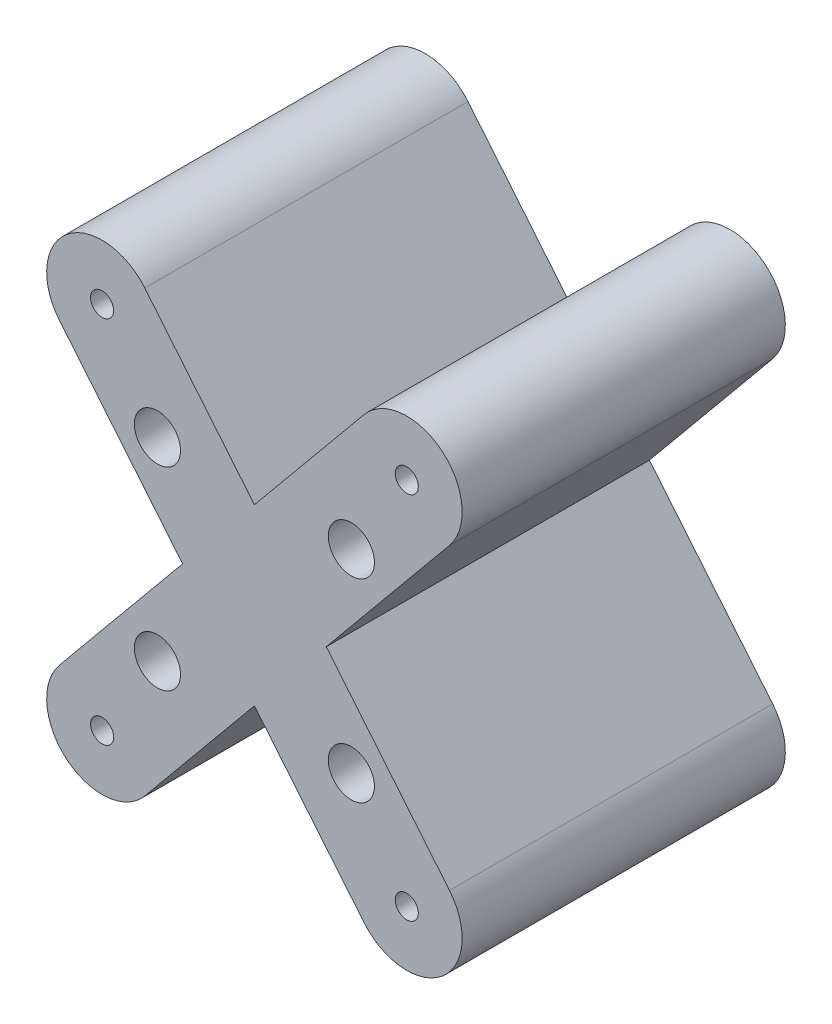
ISO-10303-21;
HEADER;
FILE_DESCRIPTION(('STEP AP214'),'2;1');
FILE_NAME('part.step','',(''),(''),'','','');
FILE_SCHEMA(('AUTOMOTIVE_DESIGN { 1 0 10303 214 1 1 1 1 }'));
ENDSEC;
DATA;
#1=APPLICATION_CONTEXT('core data for automotive mechanical design processes');
#2=APPLICATION_PROTOCOL_DEFINITION('international standard','automotive_design',2000,#1);
#3=PRODUCT_CONTEXT('',#1,'mechanical');
#4=PRODUCT('Part','Part','',(#3));
#5=PRODUCT_RELATED_PRODUCT_CATEGORY('part','',(#4));
#6=PRODUCT_DEFINITION_FORMATION('','',#4);
#7=PRODUCT_DEFINITION_CONTEXT('part definition',#1,'design');
#8=PRODUCT_DEFINITION('design','',#6,#7);
#9=PRODUCT_DEFINITION_SHAPE('','',#8);
#10=(LENGTH_UNIT() NAMED_UNIT(*) SI_UNIT(.MILLI.,.METRE.));
#11=(NAMED_UNIT(*) PLANE_ANGLE_UNIT() SI_UNIT($,.RADIAN.));
#12=(NAMED_UNIT(*) SI_UNIT($,.STERADIAN.) SOLID_ANGLE_UNIT());
#13=UNCERTAINTY_MEASURE_WITH_UNIT(LENGTH_MEASURE(1.E-05),#10,'distance_accuracy_value','');
#14=(GEOMETRIC_REPRESENTATION_CONTEXT(3) GLOBAL_UNCERTAINTY_ASSIGNED_CONTEXT((#13)) GLOBAL_UNIT_ASSIGNED_CONTEXT((#10,
#11,#12)) REPRESENTATION_CONTEXT('',''));
#15=CARTESIAN_POINT('',(0.,0.,0.));
#16=DIRECTION('',(0.,0.,1.));
#17=DIRECTION('',(1.,0.,0.));
#18=AXIS2_PLACEMENT_3D('',#15,#16,#17);
#19=CARTESIAN_POINT('',(33.,40.,70.));
#20=DIRECTION('',(0.,0.,-1.));
#21=DIRECTION('',(-1.,0.,0.));
#22=AXIS2_PLACEMENT_3D('',#19,#20,#21);
#23=CYLINDRICAL_SURFACE('',#22,2.5);
#24=CARTESIAN_POINT('',(33.,40.,70.));
#25=DIRECTION('',(0.,0.,1.));
#26=DIRECTION('',(1.,0.,0.));
#27=AXIS2_PLACEMENT_3D('',#24,#25,#26);
#28=CIRCLE('',#27,2.5);
#29=CARTESIAN_POINT('',(35.5,40.,70.));
#30=VERTEX_POINT('',#29);
#31=EDGE_CURVE('E281',#30,#30,#28,.T.);
#32=ORIENTED_EDGE('',*,*,#31,.T.);
#33=EDGE_LOOP('',(#32));
#34=FACE_BOUND('',#33,.T.);
#35=CARTESIAN_POINT('',(33.,40.,65.));
#36=DIRECTION('',(0.,0.,-1.));
#37=DIRECTION('',(-1.,0.,0.));
#38=AXIS2_PLACEMENT_3D('',#35,#36,#37);
#39=CIRCLE('',#38,2.5);
#40=CARTESIAN_POINT('',(30.5,40.,65.));
#41=VERTEX_POINT('',#40);
#42=EDGE_CURVE('E37',#41,#41,#39,.T.);
#43=ORIENTED_EDGE('',*,*,#42,.T.);
#44=EDGE_LOOP('',(#43));
#45=FACE_BOUND('',#44,.T.);
#46=ADVANCED_FACE('F33',(#34,#45),#23,.F.);
#47=CARTESIAN_POINT('',(-33.,-40.,70.));
#48=DIRECTION('',(0.,0.,-1.));
#49=DIRECTION('',(-1.,0.,0.));
#50=AXIS2_PLACEMENT_3D('',#47,#48,#49);
#51=CYLINDRICAL_SURFACE('',#50,2.5);
#52=CARTESIAN_POINT('',(-33.,-40.,70.));
#53=DIRECTION('',(0.,0.,1.));
#54=DIRECTION('',(1.,0.,0.));
#55=AXIS2_PLACEMENT_3D('',#52,#53,#54);
#56=CIRCLE('',#55,2.5);
#57=CARTESIAN_POINT('',(-30.5,-40.,70.));
#58=VERTEX_POINT('',#57);
#59=EDGE_CURVE('E266',#58,#58,#56,.T.);
#60=ORIENTED_EDGE('',*,*,#59,.T.);
#61=EDGE_LOOP('',(#60));
#62=FACE_BOUND('',#61,.T.);
#63=CARTESIAN_POINT('',(-33.,-40.,65.));
#64=DIRECTION('',(0.,0.,-1.));
#65=DIRECTION('',(-1.,0.,0.));
#66=AXIS2_PLACEMENT_3D('',#63,#64,#65);
#67=CIRCLE('',#66,2.5);
#68=CARTESIAN_POINT('',(-35.5,-40.,65.));
#69=VERTEX_POINT('',#68);
#70=EDGE_CURVE('E227',#69,#69,#67,.T.);
#71=ORIENTED_EDGE('',*,*,#70,.T.);
#72=EDGE_LOOP('',(#71));
#73=FACE_BOUND('',#72,.T.);
#74=ADVANCED_FACE('F331',(#62,#73),#51,.F.);
#75=CARTESIAN_POINT('',(33.,-40.,70.));
#76=DIRECTION('',(0.,0.,-1.));
#77=DIRECTION('',(-1.,0.,0.));
#78=AXIS2_PLACEMENT_3D('',#75,#76,#77);
#79=CYLINDRICAL_SURFACE('',#78,2.5);
#80=CARTESIAN_POINT('',(33.,-40.,70.));
#81=DIRECTION('',(0.,0.,1.));
#82=DIRECTION('',(1.,0.,0.));
#83=AXIS2_PLACEMENT_3D('',#80,#81,#82);
#84=CIRCLE('',#83,2.5);
#85=CARTESIAN_POINT('',(35.5,-40.,70.));
#86=VERTEX_POINT('',#85);
#87=EDGE_CURVE('E207',#86,#86,#84,.T.);
#88=ORIENTED_EDGE('',*,*,#87,.T.);
#89=EDGE_LOOP('',(#88));
#90=FACE_BOUND('',#89,.T.);
#91=CARTESIAN_POINT('',(33.,-40.,65.));
#92=DIRECTION('',(0.,0.,-1.));
#93=DIRECTION('',(-1.,0.,0.));
#94=AXIS2_PLACEMENT_3D('',#91,#92,#93);
#95=CIRCLE('',#94,2.5);
#96=CARTESIAN_POINT('',(30.5,-40.,65.));
#97=VERTEX_POINT('',#96);
#98=EDGE_CURVE('E225',#97,#97,#95,.T.);
#99=ORIENTED_EDGE('',*,*,#98,.T.);
#100=EDGE_LOOP('',(#99));
#101=FACE_BOUND('',#100,.T.);
#102=ADVANCED_FACE('F337',(#90,#101),#79,.F.);
#103=CARTESIAN_POINT('',(-33.,40.,70.));
#104=DIRECTION('',(0.,0.,-1.));
#105=DIRECTION('',(-1.,0.,0.));
#106=AXIS2_PLACEMENT_3D('',#103,#104,#105);
#107=CYLINDRICAL_SURFACE('',#106,2.5);
#108=CARTESIAN_POINT('',(-33.,40.,70.));
#109=DIRECTION('',(0.,0.,1.));
#110=DIRECTION('',(1.,0.,0.));
#111=AXIS2_PLACEMENT_3D('',#108,#109,#110);
#112=CIRCLE('',#111,2.5);
#113=CARTESIAN_POINT('',(-30.5,40.,70.));
#114=VERTEX_POINT('',#113);
#115=EDGE_CURVE('E161',#114,#114,#112,.T.);
#116=ORIENTED_EDGE('',*,*,#115,.T.);
#117=EDGE_LOOP('',(#116));
#118=FACE_BOUND('',#117,.T.);
#119=CARTESIAN_POINT('',(-33.,40.,65.));
#120=DIRECTION('',(0.,0.,-1.));
#121=DIRECTION('',(-1.,0.,0.));
#122=AXIS2_PLACEMENT_3D('',#119,#120,#121);
#123=CIRCLE('',#122,2.5);
#124=CARTESIAN_POINT('',(-35.5,40.,65.));
#125=VERTEX_POINT('',#124);
#126=EDGE_CURVE('E220',#125,#125,#123,.T.);
#127=ORIENTED_EDGE('',*,*,#126,.T.);
#128=EDGE_LOOP('',(#127));
#129=FACE_BOUND('',#128,.T.);
#130=ADVANCED_FACE('F344',(#118,#129),#107,.F.);
#131=CARTESIAN_POINT('',(-21.,21.,70.));
#132=DIRECTION('',(0.,0.,-1.));
#133=DIRECTION('',(-1.,0.,0.));
#134=AXIS2_PLACEMENT_3D('',#131,#132,#133);
#135=CYLINDRICAL_SURFACE('',#134,2.5);
#136=CARTESIAN_POINT('',(-21.,21.,0.));
#137=DIRECTION('',(0.,0.,1.));
#138=DIRECTION('',(1.,0.,0.));
#139=AXIS2_PLACEMENT_3D('',#136,#137,#138);
#140=CIRCLE('',#139,2.5);
#141=CARTESIAN_POINT('',(-18.5,21.,0.));
#142=VERTEX_POINT('',#141);
#143=EDGE_CURVE('E278',#142,#142,#140,.T.);
#144=ORIENTED_EDGE('',*,*,#143,.F.);
#145=EDGE_LOOP('',(#144));
#146=FACE_BOUND('',#145,.T.);
#147=CARTESIAN_POINT('',(-21.,21.,10.));
#148=DIRECTION('',(0.,0.,1.));
#149=DIRECTION('',(1.,0.,0.));
#150=AXIS2_PLACEMENT_3D('',#147,#148,#149);
#151=CIRCLE('',#150,2.5);
#152=CARTESIAN_POINT('',(-18.5,21.,10.));
#153=VERTEX_POINT('',#152);
#154=EDGE_CURVE('E216',#153,#153,#151,.T.);
#155=ORIENTED_EDGE('',*,*,#154,.T.);
#156=EDGE_LOOP('',(#155));
#157=FACE_BOUND('',#156,.T.);
#158=ADVANCED_FACE('F342',(#146,#157),#135,.F.);
#159=CARTESIAN_POINT('',(21.,21.,70.));
#160=DIRECTION('',(0.,0.,-1.));
#161=DIRECTION('',(-1.,0.,0.));
#162=AXIS2_PLACEMENT_3D('',#159,#160,#161);
#163=CYLINDRICAL_SURFACE('',#162,2.5);
#164=CARTESIAN_POINT('',(21.,21.,0.));
#165=DIRECTION('',(0.,0.,1.));
#166=DIRECTION('',(1.,0.,0.));
#167=AXIS2_PLACEMENT_3D('',#164,#165,#166);
#168=CIRCLE('',#167,2.5);
#169=CARTESIAN_POINT('',(23.5,21.,0.));
#170=VERTEX_POINT('',#169);
#171=EDGE_CURVE('E275',#170,#170,#168,.T.);
#172=ORIENTED_EDGE('',*,*,#171,.F.);
#173=EDGE_LOOP('',(#172));
#174=FACE_BOUND('',#173,.T.);
#175=CARTESIAN_POINT('',(21.,21.,10.));
#176=DIRECTION('',(0.,0.,1.));
#177=DIRECTION('',(1.,0.,0.));
#178=AXIS2_PLACEMENT_3D('',#175,#176,#177);
#179=CIRCLE('',#178,2.5);
#180=CARTESIAN_POINT('',(23.5,21.,10.));
#181=VERTEX_POINT('',#180);
#182=EDGE_CURVE('E212',#181,#181,#179,.T.);
#183=ORIENTED_EDGE('',*,*,#182,.T.);
#184=EDGE_LOOP('',(#183));
#185=FACE_BOUND('',#184,.T.);
#186=ADVANCED_FACE('F453',(#174,#185),#163,.F.);
#187=CARTESIAN_POINT('',(21.,-21.,70.));
#188=DIRECTION('',(0.,0.,-1.));
#189=DIRECTION('',(-1.,0.,0.));
#190=AXIS2_PLACEMENT_3D('',#187,#188,#189);
#191=CYLINDRICAL_SURFACE('',#190,2.5);
#192=CARTESIAN_POINT('',(21.,-21.,0.));
#193=DIRECTION('',(0.,0.,1.));
#194=DIRECTION('',(1.,0.,0.));
#195=AXIS2_PLACEMENT_3D('',#192,#193,#194);
#196=CIRCLE('',#195,2.5);
#197=CARTESIAN_POINT('',(23.5,-21.,0.));
#198=VERTEX_POINT('',#197);
#199=EDGE_CURVE('E272',#198,#198,#196,.T.);
#200=ORIENTED_EDGE('',*,*,#199,.F.);
#201=EDGE_LOOP('',(#200));
#202=FACE_BOUND('',#201,.T.);
#203=CARTESIAN_POINT('',(21.,-21.,10.));
#204=DIRECTION('',(0.,0.,1.));
#205=DIRECTION('',(1.,0.,0.));
#206=AXIS2_PLACEMENT_3D('',#203,#204,#205);
#207=CIRCLE('',#206,2.5);
#208=CARTESIAN_POINT('',(23.5,-21.,10.));
#209=VERTEX_POINT('',#208);
#210=EDGE_CURVE('E209',#209,#209,#207,.T.);
#211=ORIENTED_EDGE('',*,*,#210,.T.);
#212=EDGE_LOOP('',(#211));
#213=FACE_BOUND('',#212,.T.);
#214=ADVANCED_FACE('F450',(#202,#213),#191,.F.);
#215=CARTESIAN_POINT('',(-21.,-21.,70.));
#216=DIRECTION('',(0.,0.,-1.));
#217=DIRECTION('',(-1.,0.,0.));
#218=AXIS2_PLACEMENT_3D('',#215,#216,#217);
#219=CYLINDRICAL_SURFACE('',#218,2.5);
#220=CARTESIAN_POINT('',(-21.,-21.,0.));
#221=DIRECTION('',(0.,0.,1.));
#222=DIRECTION('',(1.,0.,0.));
#223=AXIS2_PLACEMENT_3D('',#220,#221,#222);
#224=CIRCLE('',#223,2.5);
#225=CARTESIAN_POINT('',(-18.5,-21.,0.));
#226=VERTEX_POINT('',#225);
#227=EDGE_CURVE('E269',#226,#226,#224,.T.);
#228=ORIENTED_EDGE('',*,*,#227,.F.);
#229=EDGE_LOOP('',(#228));
#230=FACE_BOUND('',#229,.T.);
#231=CARTESIAN_POINT('',(-21.,-21.,10.));
#232=DIRECTION('',(0.,0.,1.));
#233=DIRECTION('',(1.,0.,0.));
#234=AXIS2_PLACEMENT_3D('',#231,#232,#233);
#235=CIRCLE('',#234,2.5);
#236=CARTESIAN_POINT('',(-18.5,-21.,10.));
#237=VERTEX_POINT('',#236);
#238=EDGE_CURVE('E204',#237,#237,#235,.T.);
#239=ORIENTED_EDGE('',*,*,#238,.T.);
#240=EDGE_LOOP('',(#239));
#241=FACE_BOUND('',#240,.T.);
#242=ADVANCED_FACE('F349',(#230,#241),#219,.F.);
#243=CARTESIAN_POINT('',(33.,40.,70.));
#244=DIRECTION('',(0.,0.,1.));
#245=DIRECTION('',(1.,0.,0.));
#246=AXIS2_PLACEMENT_3D('',#243,#244,#245);
#247=PLANE('',#246);
#248=CARTESIAN_POINT('',(-21.,21.,70.));
#249=DIRECTION('',(0.,0.,1.));
#250=DIRECTION('',(1.,0.,0.));
#251=AXIS2_PLACEMENT_3D('',#248,#249,#250);
#252=CIRCLE('',#251,5.);
#253=CARTESIAN_POINT('',(-16.,21.,70.));
#254=VERTEX_POINT('',#253);
#255=EDGE_CURVE('E246',#254,#254,#252,.T.);
#256=ORIENTED_EDGE('',*,*,#255,.F.);
#257=EDGE_LOOP('',(#256));
#258=FACE_BOUND('',#257,.T.);
#259=CARTESIAN_POINT('',(21.,21.,70.));
#260=DIRECTION('',(0.,0.,1.));
#261=DIRECTION('',(1.,0.,0.));
#262=AXIS2_PLACEMENT_3D('',#259,#260,#261);
#263=CIRCLE('',#262,5.);
#264=CARTESIAN_POINT('',(26.,21.,70.));
#265=VERTEX_POINT('',#264);
#266=EDGE_CURVE('E252',#265,#265,#263,.T.);
#267=ORIENTED_EDGE('',*,*,#266,.F.);
#268=EDGE_LOOP('',(#267));
#269=FACE_BOUND('',#268,.T.);
#270=CARTESIAN_POINT('',(21.,-21.,70.));
#271=DIRECTION('',(0.,0.,1.));
#272=DIRECTION('',(1.,0.,0.));
#273=AXIS2_PLACEMENT_3D('',#270,#271,#272);
#274=CIRCLE('',#273,5.);
#275=CARTESIAN_POINT('',(26.,-21.,70.));
#276=VERTEX_POINT('',#275);
#277=EDGE_CURVE('E223',#276,#276,#274,.T.);
#278=ORIENTED_EDGE('',*,*,#277,.F.);
#279=EDGE_LOOP('',(#278));
#280=FACE_BOUND('',#279,.T.);
#281=CARTESIAN_POINT('',(-21.,-21.,70.));
#282=DIRECTION('',(0.,0.,1.));
#283=DIRECTION('',(1.,0.,0.));
#284=AXIS2_PLACEMENT_3D('',#281,#282,#283);
#285=CIRCLE('',#284,5.);
#286=CARTESIAN_POINT('',(-16.,-21.,70.));
#287=VERTEX_POINT('',#286);
#288=EDGE_CURVE('E219',#287,#287,#285,.T.);
#289=ORIENTED_EDGE('',*,*,#288,.F.);
#290=EDGE_LOOP('',(#289));
#291=FACE_BOUND('',#290,.T.);
#292=ORIENTED_EDGE('',*,*,#59,.F.);
#293=EDGE_LOOP('',(#292));
#294=FACE_BOUND('',#293,.T.);
#295=ORIENTED_EDGE('',*,*,#115,.F.);
#296=EDGE_LOOP('',(#295));
#297=FACE_BOUND('',#296,.T.);
#298=CARTESIAN_POINT('',(33.,40.,70.));
#299=DIRECTION('',(0.,0.,1.));
#300=DIRECTION('',(1.,0.,0.));
#301=AXIS2_PLACEMENT_3D('',#298,#299,#300);
#302=CIRCLE('',#301,12.);
#303=CARTESIAN_POINT('',(42.2564793424809,32.3634045424532,70.));
#304=VERTEX_POINT('',#303);
#305=CARTESIAN_POINT('',(23.7435206575191,47.6365954575467,70.));
#306=VERTEX_POINT('',#305);
#307=EDGE_CURVE('E180',#304,#306,#302,.T.);
#308=ORIENTED_EDGE('',*,*,#307,.T.);
#309=DIRECTION('',(-0.636382954795564,-0.771373278540077,0.));
#310=VECTOR('',#309,1.);
#311=CARTESIAN_POINT('',(23.7435206575191,47.6365954575467,70.));
#312=LINE('',#311,#310);
#313=CARTESIAN_POINT('',(0.,18.8565704181297,70.));
#314=VERTEX_POINT('',#313);
#315=EDGE_CURVE('E107',#306,#314,#312,.T.);
#316=ORIENTED_EDGE('',*,*,#315,.T.);
#317=DIRECTION('',(-0.636382954795564,0.771373278540077,0.));
#318=VECTOR('',#317,1.);
#319=CARTESIAN_POINT('',(0.,18.8565704181297,70.));
#320=LINE('',#319,#318);
#321=CARTESIAN_POINT('',(-23.7435206575191,47.6365954575468,70.));
#322=VERTEX_POINT('',#321);
#323=EDGE_CURVE('E288',#314,#322,#320,.T.);
#324=ORIENTED_EDGE('',*,*,#323,.T.);
#325=CARTESIAN_POINT('',(-33.,40.,70.));
#326=DIRECTION('',(0.,0.,1.));
#327=DIRECTION('',(1.,0.,0.));
#328=AXIS2_PLACEMENT_3D('',#325,#326,#327);
#329=CIRCLE('',#328,12.);
#330=CARTESIAN_POINT('',(-42.256479342481,32.3634045424532,70.));
#331=VERTEX_POINT('',#330);
#332=EDGE_CURVE('E290',#322,#331,#329,.T.);
#333=ORIENTED_EDGE('',*,*,#332,.T.);
#334=DIRECTION('',(0.636382954795564,-0.771373278540077,0.));
#335=VECTOR('',#334,1.);
#336=CARTESIAN_POINT('',(-15.556670594957,0.,70.));
#337=LINE('',#336,#335);
#338=CARTESIAN_POINT('',(-15.556670594957,0.,70.));
#339=VERTEX_POINT('',#338);
#340=EDGE_CURVE('E292',#331,#339,#337,.T.);
#341=ORIENTED_EDGE('',*,*,#340,.T.);
#342=DIRECTION('',(-0.636382954795564,-0.771373278540077,0.));
#343=VECTOR('',#342,1.);
#344=CARTESIAN_POINT('',(-15.556670594957,0.,70.));
#345=LINE('',#344,#343);
#346=CARTESIAN_POINT('',(-42.2564793424809,-32.3634045424532,70.));
#347=VERTEX_POINT('',#346);
#348=EDGE_CURVE('E294',#339,#347,#345,.T.);
#349=ORIENTED_EDGE('',*,*,#348,.T.);
#350=CARTESIAN_POINT('',(-33.,-40.,70.));
#351=DIRECTION('',(0.,0.,1.));
#352=DIRECTION('',(1.,0.,0.));
#353=AXIS2_PLACEMENT_3D('',#350,#351,#352);
#354=CIRCLE('',#353,12.);
#355=CARTESIAN_POINT('',(-23.7435206575191,-47.6365954575468,70.));
#356=VERTEX_POINT('',#355);
#357=EDGE_CURVE('E296',#347,#356,#354,.T.);
#358=ORIENTED_EDGE('',*,*,#357,.T.);
#359=DIRECTION('',(0.636382954795564,0.771373278540077,0.));
#360=VECTOR('',#359,1.);
#361=CARTESIAN_POINT('',(0.,-18.8565704181297,70.));
#362=LINE('',#361,#360);
#363=CARTESIAN_POINT('',(0.,-18.8565704181297,70.));
#364=VERTEX_POINT('',#363);
#365=EDGE_CURVE('E298',#356,#364,#362,.T.);
#366=ORIENTED_EDGE('',*,*,#365,.T.);
#367=DIRECTION('',(0.636382954795564,-0.771373278540077,0.));
#368=VECTOR('',#367,1.);
#369=CARTESIAN_POINT('',(23.7435206575191,-47.6365954575468,70.));
#370=LINE('',#369,#368);
#371=CARTESIAN_POINT('',(23.7435206575191,-47.6365954575468,70.));
#372=VERTEX_POINT('',#371);
#373=EDGE_CURVE('E139',#364,#372,#370,.T.);
#374=ORIENTED_EDGE('',*,*,#373,.T.);
#375=CARTESIAN_POINT('',(33.,-40.,70.));
#376=DIRECTION('',(0.,0.,1.));
#377=DIRECTION('',(1.,0.,0.));
#378=AXIS2_PLACEMENT_3D('',#375,#376,#377);
#379=CIRCLE('',#378,12.);
#380=CARTESIAN_POINT('',(42.2564793424809,-32.3634045424532,70.));
#381=VERTEX_POINT('',#380);
#382=EDGE_CURVE('E132',#372,#381,#379,.T.);
#383=ORIENTED_EDGE('',*,*,#382,.T.);
#384=DIRECTION('',(-0.636382954795564,0.771373278540077,0.));
#385=VECTOR('',#384,1.);
#386=CARTESIAN_POINT('',(42.2564793424809,-32.3634045424532,70.));
#387=LINE('',#386,#385);
#388=CARTESIAN_POINT('',(15.556670594957,0.,70.));
#389=VERTEX_POINT('',#388);
#390=EDGE_CURVE('E137',#381,#389,#387,.T.);
#391=ORIENTED_EDGE('',*,*,#390,.T.);
#392=DIRECTION('',(0.636382954795564,0.771373278540077,0.));
#393=VECTOR('',#392,1.);
#394=CARTESIAN_POINT('',(42.2564793424809,32.3634045424532,70.));
#395=LINE('',#394,#393);
#396=EDGE_CURVE('E52',#389,#304,#395,.T.);
#397=ORIENTED_EDGE('',*,*,#396,.T.);
#398=EDGE_LOOP('',(#308,#316,#324,#333,#341,#349,#358,#366,#374,#383,#391,#397));
#399=FACE_BOUND('',#398,.T.);
#400=ORIENTED_EDGE('',*,*,#31,.F.);
#401=EDGE_LOOP('',(#400));
#402=FACE_BOUND('',#401,.T.);
#403=ORIENTED_EDGE('',*,*,#87,.F.);
#404=EDGE_LOOP('',(#403));
#405=FACE_BOUND('',#404,.T.);
#406=ADVANCED_FACE('F134',(#258,#269,#280,#291,#294,#297,#399,#402,#405),#247,.T.);
#407=CARTESIAN_POINT('',(33.,40.,0.));
#408=DIRECTION('',(0.,0.,1.));
#409=DIRECTION('',(1.,0.,0.));
#410=AXIS2_PLACEMENT_3D('',#407,#408,#409);
#411=PLANE('',#410);
#412=CARTESIAN_POINT('',(-33.,-40.,0.));
#413=DIRECTION('',(0.,0.,-1.));
#414=DIRECTION('',(-1.,0.,0.));
#415=AXIS2_PLACEMENT_3D('',#412,#413,#414);
#416=CIRCLE('',#415,6.);
#417=CARTESIAN_POINT('',(-39.,-40.,0.));
#418=VERTEX_POINT('',#417);
#419=EDGE_CURVE('E360',#418,#418,#416,.T.);
#420=ORIENTED_EDGE('',*,*,#419,.F.);
#421=EDGE_LOOP('',(#420));
#422=FACE_BOUND('',#421,.T.);
#423=CARTESIAN_POINT('',(33.,40.,0.));
#424=DIRECTION('',(0.,0.,-1.));
#425=DIRECTION('',(-1.,0.,0.));
#426=AXIS2_PLACEMENT_3D('',#423,#424,#425);
#427=CIRCLE('',#426,6.);
#428=CARTESIAN_POINT('',(27.,40.,0.));
#429=VERTEX_POINT('',#428);
#430=EDGE_CURVE('E364',#429,#429,#427,.T.);
#431=ORIENTED_EDGE('',*,*,#430,.F.);
#432=EDGE_LOOP('',(#431));
#433=FACE_BOUND('',#432,.T.);
#434=CARTESIAN_POINT('',(33.,-40.,0.));
#435=DIRECTION('',(0.,0.,-1.));
#436=DIRECTION('',(-1.,0.,0.));
#437=AXIS2_PLACEMENT_3D('',#434,#435,#436);
#438=CIRCLE('',#437,6.);
#439=CARTESIAN_POINT('',(27.,-40.,0.));
#440=VERTEX_POINT('',#439);
#441=EDGE_CURVE('E368',#440,#440,#438,.T.);
#442=ORIENTED_EDGE('',*,*,#441,.F.);
#443=EDGE_LOOP('',(#442));
#444=FACE_BOUND('',#443,.T.);
#445=CARTESIAN_POINT('',(-33.,40.,0.));
#446=DIRECTION('',(0.,0.,-1.));
#447=DIRECTION('',(-1.,0.,0.));
#448=AXIS2_PLACEMENT_3D('',#445,#446,#447);
#449=CIRCLE('',#448,5.99999999999999);
#450=CARTESIAN_POINT('',(-39.,40.,0.));
#451=VERTEX_POINT('',#450);
#452=EDGE_CURVE('E233',#451,#451,#449,.T.);
#453=ORIENTED_EDGE('',*,*,#452,.F.);
#454=EDGE_LOOP('',(#453));
#455=FACE_BOUND('',#454,.T.);
#456=CARTESIAN_POINT('',(33.,40.,0.));
#457=DIRECTION('',(0.,0.,1.));
#458=DIRECTION('',(1.,0.,0.));
#459=AXIS2_PLACEMENT_3D('',#456,#457,#458);
#460=CIRCLE('',#459,12.);
#461=CARTESIAN_POINT('',(42.2564793424809,32.3634045424532,0.));
#462=VERTEX_POINT('',#461);
#463=CARTESIAN_POINT('',(23.7435206575191,47.6365954575467,0.));
#464=VERTEX_POINT('',#463);
#465=EDGE_CURVE('E157',#462,#464,#460,.T.);
#466=ORIENTED_EDGE('',*,*,#465,.F.);
#467=DIRECTION('',(0.636382954795564,0.771373278540077,0.));
#468=VECTOR('',#467,1.);
#469=CARTESIAN_POINT('',(42.2564793424809,32.3634045424532,0.));
#470=LINE('',#469,#468);
#471=CARTESIAN_POINT('',(15.556670594957,0.,0.));
#472=VERTEX_POINT('',#471);
#473=EDGE_CURVE('E99',#472,#462,#470,.T.);
#474=ORIENTED_EDGE('',*,*,#473,.F.);
#475=DIRECTION('',(-0.636382954795564,0.771373278540077,0.));
#476=VECTOR('',#475,1.);
#477=CARTESIAN_POINT('',(42.2564793424809,-32.3634045424532,0.));
#478=LINE('',#477,#476);
#479=CARTESIAN_POINT('',(42.2564793424809,-32.3634045424532,0.));
#480=VERTEX_POINT('',#479);
#481=EDGE_CURVE('E93',#480,#472,#478,.T.);
#482=ORIENTED_EDGE('',*,*,#481,.F.);
#483=CARTESIAN_POINT('',(33.,-40.,0.));
#484=DIRECTION('',(0.,0.,1.));
#485=DIRECTION('',(1.,0.,0.));
#486=AXIS2_PLACEMENT_3D('',#483,#484,#485);
#487=CIRCLE('',#486,12.);
#488=CARTESIAN_POINT('',(23.7435206575191,-47.6365954575468,0.));
#489=VERTEX_POINT('',#488);
#490=EDGE_CURVE('E147',#489,#480,#487,.T.);
#491=ORIENTED_EDGE('',*,*,#490,.F.);
#492=DIRECTION('',(0.636382954795564,-0.771373278540077,0.));
#493=VECTOR('',#492,1.);
#494=CARTESIAN_POINT('',(23.7435206575191,-47.6365954575468,0.));
#495=LINE('',#494,#493);
#496=CARTESIAN_POINT('',(0.,-18.8565704181297,0.));
#497=VERTEX_POINT('',#496);
#498=EDGE_CURVE('E175',#497,#489,#495,.T.);
#499=ORIENTED_EDGE('',*,*,#498,.F.);
#500=DIRECTION('',(0.636382954795564,0.771373278540077,0.));
#501=VECTOR('',#500,1.);
#502=CARTESIAN_POINT('',(0.,-18.8565704181297,0.));
#503=LINE('',#502,#501);
#504=CARTESIAN_POINT('',(-23.7435206575191,-47.6365954575468,0.));
#505=VERTEX_POINT('',#504);
#506=EDGE_CURVE('E173',#505,#497,#503,.T.);
#507=ORIENTED_EDGE('',*,*,#506,.F.);
#508=CARTESIAN_POINT('',(-33.,-40.,0.));
#509=DIRECTION('',(0.,0.,1.));
#510=DIRECTION('',(1.,0.,0.));
#511=AXIS2_PLACEMENT_3D('',#508,#509,#510);
#512=CIRCLE('',#511,12.);
#513=CARTESIAN_POINT('',(-42.2564793424809,-32.3634045424532,0.));
#514=VERTEX_POINT('',#513);
#515=EDGE_CURVE('E171',#514,#505,#512,.T.);
#516=ORIENTED_EDGE('',*,*,#515,.F.);
#517=DIRECTION('',(-0.636382954795564,-0.771373278540077,0.));
#518=VECTOR('',#517,1.);
#519=CARTESIAN_POINT('',(-15.556670594957,0.,0.));
#520=LINE('',#519,#518);
#521=CARTESIAN_POINT('',(-15.556670594957,0.,0.));
#522=VERTEX_POINT('',#521);
#523=EDGE_CURVE('E169',#522,#514,#520,.T.);
#524=ORIENTED_EDGE('',*,*,#523,.F.);
#525=DIRECTION('',(0.636382954795564,-0.771373278540077,0.));
#526=VECTOR('',#525,1.);
#527=CARTESIAN_POINT('',(-15.556670594957,0.,0.));
#528=LINE('',#527,#526);
#529=CARTESIAN_POINT('',(-42.256479342481,32.3634045424532,0.));
#530=VERTEX_POINT('',#529);
#531=EDGE_CURVE('E167',#530,#522,#528,.T.);
#532=ORIENTED_EDGE('',*,*,#531,.F.);
#533=CARTESIAN_POINT('',(-33.,40.,0.));
#534=DIRECTION('',(0.,0.,1.));
#535=DIRECTION('',(1.,0.,0.));
#536=AXIS2_PLACEMENT_3D('',#533,#534,#535);
#537=CIRCLE('',#536,12.);
#538=CARTESIAN_POINT('',(-23.7435206575191,47.6365954575468,0.));
#539=VERTEX_POINT('',#538);
#540=EDGE_CURVE('E165',#539,#530,#537,.T.);
#541=ORIENTED_EDGE('',*,*,#540,.F.);
#542=DIRECTION('',(-0.636382954795564,0.771373278540077,0.));
#543=VECTOR('',#542,1.);
#544=CARTESIAN_POINT('',(0.,18.8565704181297,0.));
#545=LINE('',#544,#543);
#546=CARTESIAN_POINT('',(0.,18.8565704181297,0.));
#547=VERTEX_POINT('',#546);
#548=EDGE_CURVE('E163',#547,#539,#545,.T.);
#549=ORIENTED_EDGE('',*,*,#548,.F.);
#550=DIRECTION('',(-0.636382954795564,-0.771373278540077,0.));
#551=VECTOR('',#550,1.);
#552=CARTESIAN_POINT('',(23.7435206575191,47.6365954575467,0.));
#553=LINE('',#552,#551);
#554=EDGE_CURVE('E160',#464,#547,#553,.T.);
#555=ORIENTED_EDGE('',*,*,#554,.F.);
#556=EDGE_LOOP('',(#466,#474,#482,#491,#499,#507,#516,#524,#532,#541,#549,#555));
#557=FACE_BOUND('',#556,.T.);
#558=ORIENTED_EDGE('',*,*,#143,.T.);
#559=EDGE_LOOP('',(#558));
#560=FACE_BOUND('',#559,.T.);
#561=ORIENTED_EDGE('',*,*,#171,.T.);
#562=EDGE_LOOP('',(#561));
#563=FACE_BOUND('',#562,.T.);
#564=ORIENTED_EDGE('',*,*,#199,.T.);
#565=EDGE_LOOP('',(#564));
#566=FACE_BOUND('',#565,.T.);
#567=ORIENTED_EDGE('',*,*,#227,.T.);
#568=EDGE_LOOP('',(#567));
#569=FACE_BOUND('',#568,.T.);
#570=ADVANCED_FACE('F311',(#422,#433,#444,#455,#557,#560,#563,#566,#569),#411,.F.);
#571=CARTESIAN_POINT('',(33.,40.,70.));
#572=DIRECTION('',(0.,0.,-1.));
#573=DIRECTION('',(-1.,0.,0.));
#574=AXIS2_PLACEMENT_3D('',#571,#572,#573);
#575=CYLINDRICAL_SURFACE('',#574,12.);
#576=ORIENTED_EDGE('',*,*,#465,.T.);
#577=DIRECTION('',(0.,0.,-1.));
#578=VECTOR('',#577,1.);
#579=CARTESIAN_POINT('',(23.7435206575191,47.6365954575467,70.));
#580=LINE('',#579,#578);
#581=EDGE_CURVE('E11',#306,#464,#580,.T.);
#582=ORIENTED_EDGE('',*,*,#581,.F.);
#583=ORIENTED_EDGE('',*,*,#307,.F.);
#584=DIRECTION('',(0.,0.,-1.));
#585=VECTOR('',#584,1.);
#586=CARTESIAN_POINT('',(42.2564793424809,32.3634045424532,70.));
#587=LINE('',#586,#585);
#588=EDGE_CURVE('E153',#304,#462,#587,.T.);
#589=ORIENTED_EDGE('',*,*,#588,.T.);
#590=EDGE_LOOP('',(#576,#582,#583,#589));
#591=FACE_BOUND('',#590,.T.);
#592=ADVANCED_FACE('F35',(#591),#575,.T.);
#593=CARTESIAN_POINT('',(23.7435206575191,47.6365954575467,70.));
#594=DIRECTION('',(0.771373278540077,-0.636382954795564,0.));
#595=DIRECTION('',(0.636382954795564,0.771373278540077,0.));
#596=AXIS2_PLACEMENT_3D('',#593,#594,#595);
#597=PLANE('',#596);
#598=ORIENTED_EDGE('',*,*,#554,.T.);
#599=DIRECTION('',(0.,0.,-1.));
#600=VECTOR('',#599,1.);
#601=CARTESIAN_POINT('',(0.,18.8565704181297,70.));
#602=LINE('',#601,#600);
#603=EDGE_CURVE('E43',#314,#547,#602,.T.);
#604=ORIENTED_EDGE('',*,*,#603,.F.);
#605=ORIENTED_EDGE('',*,*,#315,.F.);
#606=ORIENTED_EDGE('',*,*,#581,.T.);
#607=EDGE_LOOP('',(#598,#604,#605,#606));
#608=FACE_BOUND('',#607,.T.);
#609=ADVANCED_FACE('F356',(#608),#597,.F.);
#610=CARTESIAN_POINT('',(0.,18.8565704181297,70.));
#611=DIRECTION('',(-0.771373278540077,-0.636382954795564,0.));
#612=DIRECTION('',(0.636382954795564,-0.771373278540077,0.));
#613=AXIS2_PLACEMENT_3D('',#610,#611,#612);
#614=PLANE('',#613);
#615=ORIENTED_EDGE('',*,*,#548,.T.);
#616=DIRECTION('',(0.,0.,-1.));
#617=VECTOR('',#616,1.);
#618=CARTESIAN_POINT('',(-23.7435206575191,47.6365954575468,70.));
#619=LINE('',#618,#617);
#620=EDGE_CURVE('E199',#322,#539,#619,.T.);
#621=ORIENTED_EDGE('',*,*,#620,.F.);
#622=ORIENTED_EDGE('',*,*,#323,.F.);
#623=ORIENTED_EDGE('',*,*,#603,.T.);
#624=EDGE_LOOP('',(#615,#621,#622,#623));
#625=FACE_BOUND('',#624,.T.);
#626=ADVANCED_FACE('F663',(#625),#614,.F.);
#627=CARTESIAN_POINT('',(-33.,40.,70.));
#628=DIRECTION('',(0.,0.,-1.));
#629=DIRECTION('',(-1.,0.,0.));
#630=AXIS2_PLACEMENT_3D('',#627,#628,#629);
#631=CYLINDRICAL_SURFACE('',#630,12.);
#632=ORIENTED_EDGE('',*,*,#540,.T.);
#633=DIRECTION('',(0.,0.,-1.));
#634=VECTOR('',#633,1.);
#635=CARTESIAN_POINT('',(-42.256479342481,32.3634045424532,70.));
#636=LINE('',#635,#634);
#637=EDGE_CURVE('E196',#331,#530,#636,.T.);
#638=ORIENTED_EDGE('',*,*,#637,.F.);
#639=ORIENTED_EDGE('',*,*,#332,.F.);
#640=ORIENTED_EDGE('',*,*,#620,.T.);
#641=EDGE_LOOP('',(#632,#638,#639,#640));
#642=FACE_BOUND('',#641,.T.);
#643=ADVANCED_FACE('F654',(#642),#631,.T.);
#644=CARTESIAN_POINT('',(-15.556670594957,0.,70.));
#645=DIRECTION('',(0.771373278540077,0.636382954795564,0.));
#646=DIRECTION('',(-0.636382954795564,0.771373278540077,0.));
#647=AXIS2_PLACEMENT_3D('',#644,#645,#646);
#648=PLANE('',#647);
#649=ORIENTED_EDGE('',*,*,#531,.T.);
#650=DIRECTION('',(0.,0.,-1.));
#651=VECTOR('',#650,1.);
#652=CARTESIAN_POINT('',(-15.556670594957,0.,70.));
#653=LINE('',#652,#651);
#654=EDGE_CURVE('E193',#339,#522,#653,.T.);
#655=ORIENTED_EDGE('',*,*,#654,.F.);
#656=ORIENTED_EDGE('',*,*,#340,.F.);
#657=ORIENTED_EDGE('',*,*,#637,.T.);
#658=EDGE_LOOP('',(#649,#655,#656,#657));
#659=FACE_BOUND('',#658,.T.);
#660=ADVANCED_FACE('F645',(#659),#648,.F.);
#661=CARTESIAN_POINT('',(-15.556670594957,0.,70.));
#662=DIRECTION('',(0.771373278540077,-0.636382954795564,0.));
#663=DIRECTION('',(0.636382954795564,0.771373278540077,0.));
#664=AXIS2_PLACEMENT_3D('',#661,#662,#663);
#665=PLANE('',#664);
#666=ORIENTED_EDGE('',*,*,#523,.T.);
#667=DIRECTION('',(0.,0.,-1.));
#668=VECTOR('',#667,1.);
#669=CARTESIAN_POINT('',(-42.2564793424809,-32.3634045424532,70.));
#670=LINE('',#669,#668);
#671=EDGE_CURVE('E190',#347,#514,#670,.T.);
#672=ORIENTED_EDGE('',*,*,#671,.F.);
#673=ORIENTED_EDGE('',*,*,#348,.F.);
#674=ORIENTED_EDGE('',*,*,#654,.T.);
#675=EDGE_LOOP('',(#666,#672,#673,#674));
#676=FACE_BOUND('',#675,.T.);
#677=ADVANCED_FACE('F636',(#676),#665,.F.);
#678=CARTESIAN_POINT('',(-33.,-40.,70.));
#679=DIRECTION('',(0.,0.,-1.));
#680=DIRECTION('',(-1.,0.,0.));
#681=AXIS2_PLACEMENT_3D('',#678,#679,#680);
#682=CYLINDRICAL_SURFACE('',#681,12.);
#683=ORIENTED_EDGE('',*,*,#515,.T.);
#684=DIRECTION('',(0.,0.,-1.));
#685=VECTOR('',#684,1.);
#686=CARTESIAN_POINT('',(-23.7435206575191,-47.6365954575468,70.));
#687=LINE('',#686,#685);
#688=EDGE_CURVE('E187',#356,#505,#687,.T.);
#689=ORIENTED_EDGE('',*,*,#688,.F.);
#690=ORIENTED_EDGE('',*,*,#357,.F.);
#691=ORIENTED_EDGE('',*,*,#671,.T.);
#692=EDGE_LOOP('',(#683,#689,#690,#691));
#693=FACE_BOUND('',#692,.T.);
#694=ADVANCED_FACE('F628',(#693),#682,.T.);
#695=CARTESIAN_POINT('',(0.,-18.8565704181297,70.));
#696=DIRECTION('',(-0.771373278540077,0.636382954795564,0.));
#697=DIRECTION('',(-0.636382954795564,-0.771373278540077,0.));
#698=AXIS2_PLACEMENT_3D('',#695,#696,#697);
#699=PLANE('',#698);
#700=ORIENTED_EDGE('',*,*,#506,.T.);
#701=DIRECTION('',(0.,0.,-1.));
#702=VECTOR('',#701,1.);
#703=CARTESIAN_POINT('',(0.,-18.8565704181297,70.));
#704=LINE('',#703,#702);
#705=EDGE_CURVE('E184',#364,#497,#704,.T.);
#706=ORIENTED_EDGE('',*,*,#705,.F.);
#707=ORIENTED_EDGE('',*,*,#365,.F.);
#708=ORIENTED_EDGE('',*,*,#688,.T.);
#709=EDGE_LOOP('',(#700,#706,#707,#708));
#710=FACE_BOUND('',#709,.T.);
#711=ADVANCED_FACE('F304',(#710),#699,.F.);
#712=CARTESIAN_POINT('',(23.7435206575191,-47.6365954575468,70.));
#713=DIRECTION('',(0.771373278540077,0.636382954795564,0.));
#714=DIRECTION('',(-0.636382954795564,0.771373278540077,0.));
#715=AXIS2_PLACEMENT_3D('',#712,#713,#714);
#716=PLANE('',#715);
#717=ORIENTED_EDGE('',*,*,#498,.T.);
#718=DIRECTION('',(0.,0.,-1.));
#719=VECTOR('',#718,1.);
#720=CARTESIAN_POINT('',(23.7435206575191,-47.6365954575468,70.));
#721=LINE('',#720,#719);
#722=EDGE_CURVE('E148',#372,#489,#721,.T.);
#723=ORIENTED_EDGE('',*,*,#722,.F.);
#724=ORIENTED_EDGE('',*,*,#373,.F.);
#725=ORIENTED_EDGE('',*,*,#705,.T.);
#726=EDGE_LOOP('',(#717,#723,#724,#725));
#727=FACE_BOUND('',#726,.T.);
#728=ADVANCED_FACE('F308',(#727),#716,.F.);
#729=CARTESIAN_POINT('',(33.,-40.,70.));
#730=DIRECTION('',(0.,0.,-1.));
#731=DIRECTION('',(-1.,0.,0.));
#732=AXIS2_PLACEMENT_3D('',#729,#730,#731);
#733=CYLINDRICAL_SURFACE('',#732,12.);
#734=ORIENTED_EDGE('',*,*,#490,.T.);
#735=DIRECTION('',(0.,0.,-1.));
#736=VECTOR('',#735,1.);
#737=CARTESIAN_POINT('',(42.2564793424809,-32.3634045424532,70.));
#738=LINE('',#737,#736);
#739=EDGE_CURVE('E144',#381,#480,#738,.T.);
#740=ORIENTED_EDGE('',*,*,#739,.F.);
#741=ORIENTED_EDGE('',*,*,#382,.F.);
#742=ORIENTED_EDGE('',*,*,#722,.T.);
#743=EDGE_LOOP('',(#734,#740,#741,#742));
#744=FACE_BOUND('',#743,.T.);
#745=ADVANCED_FACE('F145',(#744),#733,.T.);
#746=CARTESIAN_POINT('',(42.2564793424809,-32.3634045424532,70.));
#747=DIRECTION('',(-0.771373278540077,-0.636382954795564,0.));
#748=DIRECTION('',(0.636382954795564,-0.771373278540077,0.));
#749=AXIS2_PLACEMENT_3D('',#746,#747,#748);
#750=PLANE('',#749);
#751=ORIENTED_EDGE('',*,*,#481,.T.);
#752=DIRECTION('',(0.,0.,-1.));
#753=VECTOR('',#752,1.);
#754=CARTESIAN_POINT('',(15.556670594957,0.,70.));
#755=LINE('',#754,#753);
#756=EDGE_CURVE('E149',#389,#472,#755,.T.);
#757=ORIENTED_EDGE('',*,*,#756,.F.);
#758=ORIENTED_EDGE('',*,*,#390,.F.);
#759=ORIENTED_EDGE('',*,*,#739,.T.);
#760=EDGE_LOOP('',(#751,#757,#758,#759));
#761=FACE_BOUND('',#760,.T.);
#762=ADVANCED_FACE('F151',(#761),#750,.F.);
#763=CARTESIAN_POINT('',(42.2564793424809,32.3634045424532,70.));
#764=DIRECTION('',(-0.771373278540077,0.636382954795564,0.));
#765=DIRECTION('',(-0.636382954795564,-0.771373278540077,0.));
#766=AXIS2_PLACEMENT_3D('',#763,#764,#765);
#767=PLANE('',#766);
#768=ORIENTED_EDGE('',*,*,#473,.T.);
#769=ORIENTED_EDGE('',*,*,#588,.F.);
#770=ORIENTED_EDGE('',*,*,#396,.F.);
#771=ORIENTED_EDGE('',*,*,#756,.T.);
#772=EDGE_LOOP('',(#768,#769,#770,#771));
#773=FACE_BOUND('',#772,.T.);
#774=ADVANCED_FACE('F317',(#773),#767,.F.);
#775=CARTESIAN_POINT('',(-21.,-21.,10.));
#776=DIRECTION('',(0.,0.,1.));
#777=DIRECTION('',(1.,0.,0.));
#778=AXIS2_PLACEMENT_3D('',#775,#776,#777);
#779=CYLINDRICAL_SURFACE('',#778,5.);
#780=CARTESIAN_POINT('',(-21.,-21.,10.));
#781=DIRECTION('',(0.,0.,1.));
#782=DIRECTION('',(1.,0.,0.));
#783=AXIS2_PLACEMENT_3D('',#780,#781,#782);
#784=CIRCLE('',#783,5.);
#785=CARTESIAN_POINT('',(-16.,-21.,10.));
#786=VERTEX_POINT('',#785);
#787=EDGE_CURVE('E208',#786,#786,#784,.T.);
#788=ORIENTED_EDGE('',*,*,#787,.F.);
#789=EDGE_LOOP('',(#788));
#790=FACE_BOUND('',#789,.T.);
#791=ORIENTED_EDGE('',*,*,#288,.T.);
#792=EDGE_LOOP('',(#791));
#793=FACE_BOUND('',#792,.T.);
#794=ADVANCED_FACE('F319',(#790,#793),#779,.F.);
#795=CARTESIAN_POINT('',(-21.,-21.,10.));
#796=DIRECTION('',(0.,0.,1.));
#797=DIRECTION('',(1.,0.,0.));
#798=AXIS2_PLACEMENT_3D('',#795,#796,#797);
#799=PLANE('',#798);
#800=ORIENTED_EDGE('',*,*,#238,.F.);
#801=EDGE_LOOP('',(#800));
#802=FACE_BOUND('',#801,.T.);
#803=ORIENTED_EDGE('',*,*,#787,.T.);
#804=EDGE_LOOP('',(#803));
#805=FACE_BOUND('',#804,.T.);
#806=ADVANCED_FACE('F325',(#802,#805),#799,.T.);
#807=CARTESIAN_POINT('',(21.,-21.,10.));
#808=DIRECTION('',(0.,0.,1.));
#809=DIRECTION('',(1.,0.,0.));
#810=AXIS2_PLACEMENT_3D('',#807,#808,#809);
#811=CYLINDRICAL_SURFACE('',#810,5.);
#812=CARTESIAN_POINT('',(21.,-21.,10.));
#813=DIRECTION('',(0.,0.,1.));
#814=DIRECTION('',(1.,0.,0.));
#815=AXIS2_PLACEMENT_3D('',#812,#813,#814);
#816=CIRCLE('',#815,5.);
#817=CARTESIAN_POINT('',(26.,-21.,10.));
#818=VERTEX_POINT('',#817);
#819=EDGE_CURVE('E255',#818,#818,#816,.T.);
#820=ORIENTED_EDGE('',*,*,#819,.F.);
#821=EDGE_LOOP('',(#820));
#822=FACE_BOUND('',#821,.T.);
#823=ORIENTED_EDGE('',*,*,#277,.T.);
#824=EDGE_LOOP('',(#823));
#825=FACE_BOUND('',#824,.T.);
#826=ADVANCED_FACE('F437',(#822,#825),#811,.F.);
#827=CARTESIAN_POINT('',(21.,-21.,10.));
#828=DIRECTION('',(0.,0.,1.));
#829=DIRECTION('',(1.,0.,0.));
#830=AXIS2_PLACEMENT_3D('',#827,#828,#829);
#831=PLANE('',#830);
#832=ORIENTED_EDGE('',*,*,#210,.F.);
#833=EDGE_LOOP('',(#832));
#834=FACE_BOUND('',#833,.T.);
#835=ORIENTED_EDGE('',*,*,#819,.T.);
#836=EDGE_LOOP('',(#835));
#837=FACE_BOUND('',#836,.T.);
#838=ADVANCED_FACE('F433',(#834,#837),#831,.T.);
#839=CARTESIAN_POINT('',(21.,21.,10.));
#840=DIRECTION('',(0.,0.,1.));
#841=DIRECTION('',(1.,0.,0.));
#842=AXIS2_PLACEMENT_3D('',#839,#840,#841);
#843=CYLINDRICAL_SURFACE('',#842,5.);
#844=CARTESIAN_POINT('',(21.,21.,10.));
#845=DIRECTION('',(0.,0.,1.));
#846=DIRECTION('',(1.,0.,0.));
#847=AXIS2_PLACEMENT_3D('',#844,#845,#846);
#848=CIRCLE('',#847,5.);
#849=CARTESIAN_POINT('',(26.,21.,10.));
#850=VERTEX_POINT('',#849);
#851=EDGE_CURVE('E249',#850,#850,#848,.T.);
#852=ORIENTED_EDGE('',*,*,#851,.F.);
#853=EDGE_LOOP('',(#852));
#854=FACE_BOUND('',#853,.T.);
#855=ORIENTED_EDGE('',*,*,#266,.T.);
#856=EDGE_LOOP('',(#855));
#857=FACE_BOUND('',#856,.T.);
#858=ADVANCED_FACE('F429',(#854,#857),#843,.F.);
#859=CARTESIAN_POINT('',(21.,21.,10.));
#860=DIRECTION('',(0.,0.,1.));
#861=DIRECTION('',(1.,0.,0.));
#862=AXIS2_PLACEMENT_3D('',#859,#860,#861);
#863=PLANE('',#862);
#864=ORIENTED_EDGE('',*,*,#182,.F.);
#865=EDGE_LOOP('',(#864));
#866=FACE_BOUND('',#865,.T.);
#867=ORIENTED_EDGE('',*,*,#851,.T.);
#868=EDGE_LOOP('',(#867));
#869=FACE_BOUND('',#868,.T.);
#870=ADVANCED_FACE('F425',(#866,#869),#863,.T.);
#871=CARTESIAN_POINT('',(-21.,21.,10.));
#872=DIRECTION('',(0.,0.,1.));
#873=DIRECTION('',(1.,0.,0.));
#874=AXIS2_PLACEMENT_3D('',#871,#872,#873);
#875=CYLINDRICAL_SURFACE('',#874,5.);
#876=CARTESIAN_POINT('',(-21.,21.,10.));
#877=DIRECTION('',(0.,0.,1.));
#878=DIRECTION('',(1.,0.,0.));
#879=AXIS2_PLACEMENT_3D('',#876,#877,#878);
#880=CIRCLE('',#879,5.);
#881=CARTESIAN_POINT('',(-16.,21.,10.));
#882=VERTEX_POINT('',#881);
#883=EDGE_CURVE('E213',#882,#882,#880,.T.);
#884=ORIENTED_EDGE('',*,*,#883,.F.);
#885=EDGE_LOOP('',(#884));
#886=FACE_BOUND('',#885,.T.);
#887=ORIENTED_EDGE('',*,*,#255,.T.);
#888=EDGE_LOOP('',(#887));
#889=FACE_BOUND('',#888,.T.);
#890=ADVANCED_FACE('F421',(#886,#889),#875,.F.);
#891=CARTESIAN_POINT('',(-21.,21.,10.));
#892=DIRECTION('',(0.,0.,1.));
#893=DIRECTION('',(1.,0.,0.));
#894=AXIS2_PLACEMENT_3D('',#891,#892,#893);
#895=PLANE('',#894);
#896=ORIENTED_EDGE('',*,*,#154,.F.);
#897=EDGE_LOOP('',(#896));
#898=FACE_BOUND('',#897,.T.);
#899=ORIENTED_EDGE('',*,*,#883,.T.);
#900=EDGE_LOOP('',(#899));
#901=FACE_BOUND('',#900,.T.);
#902=ADVANCED_FACE('F417',(#898,#901),#895,.T.);
#903=CARTESIAN_POINT('',(-33.,40.,65.));
#904=DIRECTION('',(0.,0.,-1.));
#905=DIRECTION('',(-1.,0.,0.));
#906=AXIS2_PLACEMENT_3D('',#903,#904,#905);
#907=CYLINDRICAL_SURFACE('',#906,5.99999999999999);
#908=CARTESIAN_POINT('',(-33.,40.,65.));
#909=DIRECTION('',(0.,0.,-1.));
#910=DIRECTION('',(-1.,0.,0.));
#911=AXIS2_PLACEMENT_3D('',#908,#909,#910);
#912=CIRCLE('',#911,5.99999999999999);
#913=CARTESIAN_POINT('',(-39.,40.,65.));
#914=VERTEX_POINT('',#913);
#915=EDGE_CURVE('E224',#914,#914,#912,.T.);
#916=ORIENTED_EDGE('',*,*,#915,.F.);
#917=EDGE_LOOP('',(#916));
#918=FACE_BOUND('',#917,.T.);
#919=ORIENTED_EDGE('',*,*,#452,.T.);
#920=EDGE_LOOP('',(#919));
#921=FACE_BOUND('',#920,.T.);
#922=ADVANCED_FACE('F413',(#918,#921),#907,.F.);
#923=CARTESIAN_POINT('',(-33.,40.,65.));
#924=DIRECTION('',(0.,0.,-1.));
#925=DIRECTION('',(-1.,0.,0.));
#926=AXIS2_PLACEMENT_3D('',#923,#924,#925);
#927=PLANE('',#926);
#928=ORIENTED_EDGE('',*,*,#126,.F.);
#929=EDGE_LOOP('',(#928));
#930=FACE_BOUND('',#929,.T.);
#931=ORIENTED_EDGE('',*,*,#915,.T.);
#932=EDGE_LOOP('',(#931));
#933=FACE_BOUND('',#932,.T.);
#934=ADVANCED_FACE('F409',(#930,#933),#927,.T.);
#935=CARTESIAN_POINT('',(33.,-40.,65.));
#936=DIRECTION('',(0.,0.,-1.));
#937=DIRECTION('',(-1.,0.,0.));
#938=AXIS2_PLACEMENT_3D('',#935,#936,#937);
#939=CYLINDRICAL_SURFACE('',#938,6.);
#940=CARTESIAN_POINT('',(33.,-40.,65.));
#941=DIRECTION('',(0.,0.,-1.));
#942=DIRECTION('',(-1.,0.,0.));
#943=AXIS2_PLACEMENT_3D('',#940,#941,#942);
#944=CIRCLE('',#943,6.);
#945=CARTESIAN_POINT('',(27.,-40.,65.));
#946=VERTEX_POINT('',#945);
#947=EDGE_CURVE('E370',#946,#946,#944,.T.);
#948=ORIENTED_EDGE('',*,*,#947,.F.);
#949=EDGE_LOOP('',(#948));
#950=FACE_BOUND('',#949,.T.);
#951=ORIENTED_EDGE('',*,*,#441,.T.);
#952=EDGE_LOOP('',(#951));
#953=FACE_BOUND('',#952,.T.);
#954=ADVANCED_FACE('F396',(#950,#953),#939,.F.);
#955=CARTESIAN_POINT('',(33.,-40.,65.));
#956=DIRECTION('',(0.,0.,-1.));
#957=DIRECTION('',(-1.,0.,0.));
#958=AXIS2_PLACEMENT_3D('',#955,#956,#957);
#959=PLANE('',#958);
#960=ORIENTED_EDGE('',*,*,#98,.F.);
#961=EDGE_LOOP('',(#960));
#962=FACE_BOUND('',#961,.T.);
#963=ORIENTED_EDGE('',*,*,#947,.T.);
#964=EDGE_LOOP('',(#963));
#965=FACE_BOUND('',#964,.T.);
#966=ADVANCED_FACE('F387',(#962,#965),#959,.T.);
#967=CARTESIAN_POINT('',(-33.,-40.,65.));
#968=DIRECTION('',(0.,0.,-1.));
#969=DIRECTION('',(-1.,0.,0.));
#970=AXIS2_PLACEMENT_3D('',#967,#968,#969);
#971=CYLINDRICAL_SURFACE('',#970,6.);
#972=CARTESIAN_POINT('',(-33.,-40.,65.));
#973=DIRECTION('',(0.,0.,-1.));
#974=DIRECTION('',(-1.,0.,0.));
#975=AXIS2_PLACEMENT_3D('',#972,#973,#974);
#976=CIRCLE('',#975,6.);
#977=CARTESIAN_POINT('',(-39.,-40.,65.));
#978=VERTEX_POINT('',#977);
#979=EDGE_CURVE('E228',#978,#978,#976,.T.);
#980=ORIENTED_EDGE('',*,*,#979,.F.);
#981=EDGE_LOOP('',(#980));
#982=FACE_BOUND('',#981,.T.);
#983=ORIENTED_EDGE('',*,*,#419,.T.);
#984=EDGE_LOOP('',(#983));
#985=FACE_BOUND('',#984,.T.);
#986=ADVANCED_FACE('F384',(#982,#985),#971,.F.);
#987=CARTESIAN_POINT('',(-33.,-40.,65.));
#988=DIRECTION('',(0.,0.,-1.));
#989=DIRECTION('',(-1.,0.,0.));
#990=AXIS2_PLACEMENT_3D('',#987,#988,#989);
#991=PLANE('',#990);
#992=ORIENTED_EDGE('',*,*,#70,.F.);
#993=EDGE_LOOP('',(#992));
#994=FACE_BOUND('',#993,.T.);
#995=ORIENTED_EDGE('',*,*,#979,.T.);
#996=EDGE_LOOP('',(#995));
#997=FACE_BOUND('',#996,.T.);
#998=ADVANCED_FACE('F382',(#994,#997),#991,.T.);
#999=CARTESIAN_POINT('',(33.,40.,65.));
#1000=DIRECTION('',(0.,0.,-1.));
#1001=DIRECTION('',(-1.,0.,0.));
#1002=AXIS2_PLACEMENT_3D('',#999,#1000,#1001);
#1003=CYLINDRICAL_SURFACE('',#1002,6.);
#1004=CARTESIAN_POINT('',(33.,40.,65.));
#1005=DIRECTION('',(0.,0.,-1.));
#1006=DIRECTION('',(-1.,0.,0.));
#1007=AXIS2_PLACEMENT_3D('',#1004,#1005,#1006);
#1008=CIRCLE('',#1007,6.);
#1009=CARTESIAN_POINT('',(27.,40.,65.));
#1010=VERTEX_POINT('',#1009);
#1011=EDGE_CURVE('E375',#1010,#1010,#1008,.T.);
#1012=ORIENTED_EDGE('',*,*,#1011,.F.);
#1013=EDGE_LOOP('',(#1012));
#1014=FACE_BOUND('',#1013,.T.);
#1015=ORIENTED_EDGE('',*,*,#430,.T.);
#1016=EDGE_LOOP('',(#1015));
#1017=FACE_BOUND('',#1016,.T.);
#1018=ADVANCED_FACE('F393',(#1014,#1017),#1003,.F.);
#1019=CARTESIAN_POINT('',(33.,40.,65.));
#1020=DIRECTION('',(0.,0.,-1.));
#1021=DIRECTION('',(-1.,0.,0.));
#1022=AXIS2_PLACEMENT_3D('',#1019,#1020,#1021);
#1023=PLANE('',#1022);
#1024=ORIENTED_EDGE('',*,*,#42,.F.);
#1025=EDGE_LOOP('',(#1024));
#1026=FACE_BOUND('',#1025,.T.);
#1027=ORIENTED_EDGE('',*,*,#1011,.T.);
#1028=EDGE_LOOP('',(#1027));
#1029=FACE_BOUND('',#1028,.T.);
#1030=ADVANCED_FACE('F400',(#1026,#1029),#1023,.T.);
#1031=CLOSED_SHELL('',(#46,#74,#102,#130,#158,#186,#214,#242,#406,#570,#592,#609,#626,#643,#660,
#677,#694,#711,#728,#745,#762,#774,#794,#806,#826,#838,#858,#870,#890,#902,#922,#934,#954,#966,
#986,#998,#1018,#1030));
#1032=MANIFOLD_SOLID_BREP('B2',#1031);
#1033=ADVANCED_BREP_SHAPE_REPRESENTATION('',(#18,#1032),#14);
#1034=SHAPE_DEFINITION_REPRESENTATION(#9,#1033);
ENDSEC;
END-ISO-10303-21;
